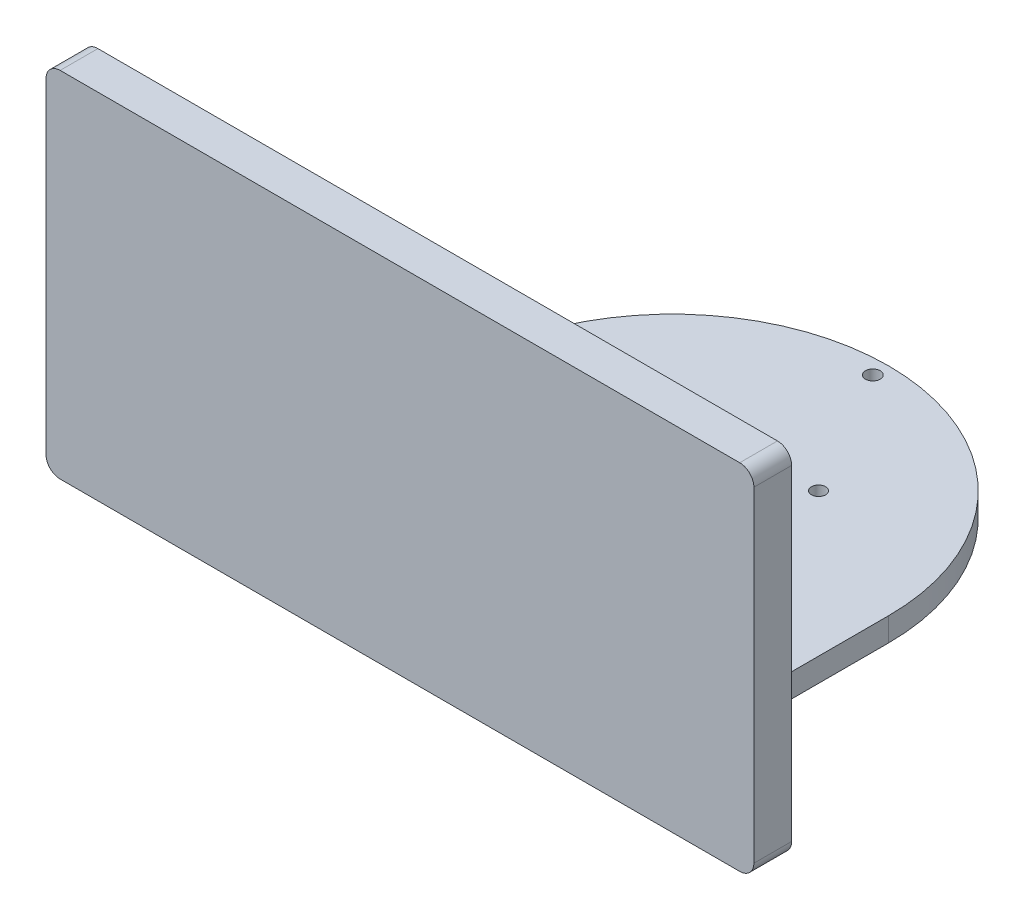
ISO-10303-21;
HEADER;
FILE_DESCRIPTION(('STEP AP214'),'2;1');
FILE_NAME('part.step','',(''),(''),'','','');
FILE_SCHEMA(('AUTOMOTIVE_DESIGN { 1 0 10303 214 1 1 1 1 }'));
ENDSEC;
DATA;
#1=APPLICATION_CONTEXT('core data for automotive mechanical design processes');
#2=APPLICATION_PROTOCOL_DEFINITION('international standard','automotive_design',2000,#1);
#3=PRODUCT_CONTEXT('',#1,'mechanical');
#4=PRODUCT('Part','Part','',(#3));
#5=PRODUCT_RELATED_PRODUCT_CATEGORY('part','',(#4));
#6=PRODUCT_DEFINITION_FORMATION('','',#4);
#7=PRODUCT_DEFINITION_CONTEXT('part definition',#1,'design');
#8=PRODUCT_DEFINITION('design','',#6,#7);
#9=PRODUCT_DEFINITION_SHAPE('','',#8);
#10=(LENGTH_UNIT() NAMED_UNIT(*) SI_UNIT(.MILLI.,.METRE.));
#11=(NAMED_UNIT(*) PLANE_ANGLE_UNIT() SI_UNIT($,.RADIAN.));
#12=(NAMED_UNIT(*) SI_UNIT($,.STERADIAN.) SOLID_ANGLE_UNIT());
#13=UNCERTAINTY_MEASURE_WITH_UNIT(LENGTH_MEASURE(1.E-05),#10,'distance_accuracy_value','');
#14=(GEOMETRIC_REPRESENTATION_CONTEXT(3) GLOBAL_UNCERTAINTY_ASSIGNED_CONTEXT((#13)) GLOBAL_UNIT_ASSIGNED_CONTEXT((#10,
#11,#12)) REPRESENTATION_CONTEXT('',''));
#15=CARTESIAN_POINT('',(0.,0.,0.));
#16=DIRECTION('',(0.,0.,1.));
#17=DIRECTION('',(1.,0.,0.));
#18=AXIS2_PLACEMENT_3D('',#15,#16,#17);
#19=CARTESIAN_POINT('',(0.,5.,0.));
#20=DIRECTION('',(0.,1.,0.));
#21=DIRECTION('',(0.,0.,1.));
#22=AXIS2_PLACEMENT_3D('',#19,#20,#21);
#23=PLANE('',#22);
#24=CARTESIAN_POINT('',(-15.4999999999997,5.,15.5));
#25=DIRECTION('',(0.,1.,0.));
#26=DIRECTION('',(0.,0.,1.));
#27=AXIS2_PLACEMENT_3D('',#24,#25,#26);
#28=CIRCLE('',#27,1.5);
#29=CARTESIAN_POINT('',(-15.4999999999997,5.,17.));
#30=VERTEX_POINT('',#29);
#31=EDGE_CURVE('E183',#30,#30,#28,.T.);
#32=ORIENTED_EDGE('',*,*,#31,.F.);
#33=EDGE_LOOP('',(#32));
#34=FACE_BOUND('',#33,.T.);
#35=CARTESIAN_POINT('',(15.5000000000003,5.,15.5));
#36=DIRECTION('',(0.,1.,0.));
#37=DIRECTION('',(0.,0.,1.));
#38=AXIS2_PLACEMENT_3D('',#35,#36,#37);
#39=CIRCLE('',#38,1.5);
#40=CARTESIAN_POINT('',(15.5000000000003,5.,17.));
#41=VERTEX_POINT('',#40);
#42=EDGE_CURVE('E208',#41,#41,#39,.T.);
#43=ORIENTED_EDGE('',*,*,#42,.F.);
#44=EDGE_LOOP('',(#43));
#45=FACE_BOUND('',#44,.T.);
#46=CARTESIAN_POINT('',(15.5,5.,-15.5));
#47=DIRECTION('',(0.,1.,0.));
#48=DIRECTION('',(0.,0.,1.));
#49=AXIS2_PLACEMENT_3D('',#46,#47,#48);
#50=CIRCLE('',#49,1.5);
#51=CARTESIAN_POINT('',(15.5,5.,-14.));
#52=VERTEX_POINT('',#51);
#53=EDGE_CURVE('E204',#52,#52,#50,.T.);
#54=ORIENTED_EDGE('',*,*,#53,.F.);
#55=EDGE_LOOP('',(#54));
#56=FACE_BOUND('',#55,.T.);
#57=CARTESIAN_POINT('',(0.,5.,0.));
#58=DIRECTION('',(0.,1.,0.));
#59=DIRECTION('',(0.,0.,1.));
#60=AXIS2_PLACEMENT_3D('',#57,#58,#59);
#61=CIRCLE('',#60,7.);
#62=CARTESIAN_POINT('',(0.,5.,7.00000000000001));
#63=VERTEX_POINT('',#62);
#64=EDGE_CURVE('E199',#63,#63,#61,.T.);
#65=ORIENTED_EDGE('',*,*,#64,.F.);
#66=EDGE_LOOP('',(#65));
#67=FACE_BOUND('',#66,.T.);
#68=CARTESIAN_POINT('',(-15.5,5.,-15.5));
#69=DIRECTION('',(0.,1.,0.));
#70=DIRECTION('',(0.,0.,1.));
#71=AXIS2_PLACEMENT_3D('',#68,#69,#70);
#72=CIRCLE('',#71,1.5);
#73=CARTESIAN_POINT('',(-15.5,5.,-14.));
#74=VERTEX_POINT('',#73);
#75=EDGE_CURVE('E203',#74,#74,#72,.T.);
#76=ORIENTED_EDGE('',*,*,#75,.F.);
#77=EDGE_LOOP('',(#76));
#78=FACE_BOUND('',#77,.T.);
#79=CARTESIAN_POINT('',(0.,5.,-42.5));
#80=DIRECTION('',(0.,1.,0.));
#81=DIRECTION('',(0.,0.,1.));
#82=AXIS2_PLACEMENT_3D('',#79,#80,#81);
#83=CIRCLE('',#82,1.565);
#84=CARTESIAN_POINT('',(0.,5.,-40.935));
#85=VERTEX_POINT('',#84);
#86=EDGE_CURVE('E219',#85,#85,#83,.T.);
#87=ORIENTED_EDGE('',*,*,#86,.F.);
#88=EDGE_LOOP('',(#87));
#89=FACE_BOUND('',#88,.T.);
#90=CARTESIAN_POINT('',(36.8060796608414,5.,21.2499999999984));
#91=DIRECTION('',(0.,1.,0.));
#92=DIRECTION('',(0.,0.,1.));
#93=AXIS2_PLACEMENT_3D('',#90,#91,#92);
#94=CIRCLE('',#93,1.56500000000232);
#95=CARTESIAN_POINT('',(36.8060796608414,5.,22.8150000000008));
#96=VERTEX_POINT('',#95);
#97=EDGE_CURVE('E224',#96,#96,#94,.T.);
#98=ORIENTED_EDGE('',*,*,#97,.F.);
#99=EDGE_LOOP('',(#98));
#100=FACE_BOUND('',#99,.T.);
#101=CARTESIAN_POINT('',(-36.8060796608359,5.,21.2500000000016));
#102=DIRECTION('',(0.,1.,0.));
#103=DIRECTION('',(0.,0.,1.));
#104=AXIS2_PLACEMENT_3D('',#101,#102,#103);
#105=CIRCLE('',#104,1.56500000000342);
#106=CARTESIAN_POINT('',(-36.8060796608359,5.,22.815000000005));
#107=VERTEX_POINT('',#106);
#108=EDGE_CURVE('E228',#107,#107,#105,.T.);
#109=ORIENTED_EDGE('',*,*,#108,.F.);
#110=EDGE_LOOP('',(#109));
#111=FACE_BOUND('',#110,.T.);
#112=DIRECTION('',(0.,0.,1.));
#113=VECTOR('',#112,1.);
#114=CARTESIAN_POINT('',(-45.85,5.,0.));
#115=LINE('',#114,#113);
#116=CARTESIAN_POINT('',(-45.85,5.,0.));
#117=VERTEX_POINT('',#116);
#118=CARTESIAN_POINT('',(-45.85,5.,46.7087672773216));
#119=VERTEX_POINT('',#118);
#120=EDGE_CURVE('E190',#117,#119,#115,.T.);
#121=ORIENTED_EDGE('',*,*,#120,.T.);
#122=DIRECTION('',(1.,0.,0.));
#123=VECTOR('',#122,1.);
#124=CARTESIAN_POINT('',(0.,5.,46.7087672773216));
#125=LINE('',#124,#123);
#126=CARTESIAN_POINT('',(45.85,5.,46.7087672773216));
#127=VERTEX_POINT('',#126);
#128=EDGE_CURVE('E276',#119,#127,#125,.T.);
#129=ORIENTED_EDGE('',*,*,#128,.T.);
#130=DIRECTION('',(0.,0.,-1.));
#131=VECTOR('',#130,1.);
#132=CARTESIAN_POINT('',(45.85,5.,57.7087672773216));
#133=LINE('',#132,#131);
#134=CARTESIAN_POINT('',(45.85,5.,0.));
#135=VERTEX_POINT('',#134);
#136=EDGE_CURVE('E193',#127,#135,#133,.T.);
#137=ORIENTED_EDGE('',*,*,#136,.T.);
#138=CARTESIAN_POINT('',(0.,5.,0.));
#139=DIRECTION('',(0.,1.,0.));
#140=DIRECTION('',(0.,0.,1.));
#141=AXIS2_PLACEMENT_3D('',#138,#139,#140);
#142=CIRCLE('',#141,45.85);
#143=EDGE_CURVE('E160',#135,#117,#142,.T.);
#144=ORIENTED_EDGE('',*,*,#143,.T.);
#145=EDGE_LOOP('',(#121,#129,#137,#144));
#146=FACE_BOUND('',#145,.T.);
#147=ADVANCED_FACE('F43',(#34,#45,#56,#67,#78,#89,#100,#111,#146),#23,.T.);
#148=CARTESIAN_POINT('',(45.85,-108.347551059856,57.7087672773216));
#149=DIRECTION('',(1.,0.,0.));
#150=DIRECTION('',(0.,0.,-1.));
#151=AXIS2_PLACEMENT_3D('',#148,#149,#150);
#152=PLANE('',#151);
#153=ORIENTED_EDGE('',*,*,#136,.F.);
#154=DIRECTION('',(0.,-1.,0.));
#155=VECTOR('',#154,1.);
#156=CARTESIAN_POINT('',(45.85,-108.347551059856,46.7087672773216));
#157=LINE('',#156,#155);
#158=CARTESIAN_POINT('',(45.85,0.,46.7087672773216));
#159=VERTEX_POINT('',#158);
#160=EDGE_CURVE('E177',#127,#159,#157,.T.);
#161=ORIENTED_EDGE('',*,*,#160,.T.);
#162=DIRECTION('',(0.,0.,1.));
#163=VECTOR('',#162,1.);
#164=CARTESIAN_POINT('',(45.85,0.,57.7087672773216));
#165=LINE('',#164,#163);
#166=CARTESIAN_POINT('',(45.85,0.,0.));
#167=VERTEX_POINT('',#166);
#168=EDGE_CURVE('E154',#167,#159,#165,.T.);
#169=ORIENTED_EDGE('',*,*,#168,.F.);
#170=DIRECTION('',(0.,1.,0.));
#171=VECTOR('',#170,1.);
#172=CARTESIAN_POINT('',(45.85,-108.347551059856,0.));
#173=LINE('',#172,#171);
#174=EDGE_CURVE('E165',#167,#135,#173,.T.);
#175=ORIENTED_EDGE('',*,*,#174,.T.);
#176=EDGE_LOOP('',(#153,#161,#169,#175));
#177=FACE_BOUND('',#176,.T.);
#178=ADVANCED_FACE('F175',(#177),#152,.T.);
#179=CARTESIAN_POINT('',(-45.85,-108.347551059856,0.));
#180=DIRECTION('',(-1.,0.,0.));
#181=DIRECTION('',(0.,0.,1.));
#182=AXIS2_PLACEMENT_3D('',#179,#180,#181);
#183=PLANE('',#182);
#184=DIRECTION('',(0.,0.,-1.));
#185=VECTOR('',#184,1.);
#186=CARTESIAN_POINT('',(-45.85,0.,0.));
#187=LINE('',#186,#185);
#188=CARTESIAN_POINT('',(-45.85,0.,46.7087672773216));
#189=VERTEX_POINT('',#188);
#190=CARTESIAN_POINT('',(-45.85,0.,0.));
#191=VERTEX_POINT('',#190);
#192=EDGE_CURVE('E156',#189,#191,#187,.T.);
#193=ORIENTED_EDGE('',*,*,#192,.F.);
#194=DIRECTION('',(0.,1.,0.));
#195=VECTOR('',#194,1.);
#196=CARTESIAN_POINT('',(-45.85,-108.347551059856,46.7087672773216));
#197=LINE('',#196,#195);
#198=EDGE_CURVE('E273',#189,#119,#197,.T.);
#199=ORIENTED_EDGE('',*,*,#198,.T.);
#200=ORIENTED_EDGE('',*,*,#120,.F.);
#201=DIRECTION('',(0.,1.,0.));
#202=VECTOR('',#201,1.);
#203=CARTESIAN_POINT('',(-45.85,-108.347551059856,0.));
#204=LINE('',#203,#202);
#205=EDGE_CURVE('E172',#191,#117,#204,.T.);
#206=ORIENTED_EDGE('',*,*,#205,.F.);
#207=EDGE_LOOP('',(#193,#199,#200,#206));
#208=FACE_BOUND('',#207,.T.);
#209=ADVANCED_FACE('F403',(#208),#183,.T.);
#210=CARTESIAN_POINT('',(0.,5.,0.));
#211=DIRECTION('',(0.,-1.,0.));
#212=DIRECTION('',(0.,0.,-1.));
#213=AXIS2_PLACEMENT_3D('',#210,#211,#212);
#214=CYLINDRICAL_SURFACE('',#213,45.85);
#215=ORIENTED_EDGE('',*,*,#143,.F.);
#216=ORIENTED_EDGE('',*,*,#174,.F.);
#217=CARTESIAN_POINT('',(0.,0.,0.));
#218=DIRECTION('',(0.,1.,0.));
#219=DIRECTION('',(0.,0.,1.));
#220=AXIS2_PLACEMENT_3D('',#217,#218,#219);
#221=CIRCLE('',#220,45.85);
#222=EDGE_CURVE('E147',#167,#191,#221,.T.);
#223=ORIENTED_EDGE('',*,*,#222,.T.);
#224=ORIENTED_EDGE('',*,*,#205,.T.);
#225=EDGE_LOOP('',(#215,#216,#223,#224));
#226=FACE_BOUND('',#225,.T.);
#227=ADVANCED_FACE('F166',(#226),#214,.T.);
#228=CARTESIAN_POINT('',(0.,0.,0.));
#229=DIRECTION('',(0.,1.,0.));
#230=DIRECTION('',(0.,0.,1.));
#231=AXIS2_PLACEMENT_3D('',#228,#229,#230);
#232=PLANE('',#231);
#233=DIRECTION('',(-1.,0.,0.));
#234=VECTOR('',#233,1.);
#235=CARTESIAN_POINT('',(-75.,0.,49.7087672773216));
#236=LINE('',#235,#234);
#237=CARTESIAN_POINT('',(72.,0.,49.7087672773215));
#238=VERTEX_POINT('',#237);
#239=CARTESIAN_POINT('',(48.85,0.,49.7087672773216));
#240=VERTEX_POINT('',#239);
#241=EDGE_CURVE('E364',#238,#240,#236,.T.);
#242=ORIENTED_EDGE('',*,*,#241,.F.);
#243=DIRECTION('',(0.,0.,-1.));
#244=VECTOR('',#243,1.);
#245=CARTESIAN_POINT('',(71.9999999999999,0.,-1.2490009027033E-13));
#246=LINE('',#245,#244);
#247=CARTESIAN_POINT('',(72.,0.,57.7087672773216));
#248=VERTEX_POINT('',#247);
#249=EDGE_CURVE('E316',#238,#248,#246,.F.);
#250=ORIENTED_EDGE('',*,*,#249,.T.);
#251=DIRECTION('',(-1.,0.,0.));
#252=VECTOR('',#251,1.);
#253=CARTESIAN_POINT('',(-45.85,0.,57.7087672773216));
#254=LINE('',#253,#252);
#255=CARTESIAN_POINT('',(-72.,0.,57.7087672773216));
#256=VERTEX_POINT('',#255);
#257=EDGE_CURVE('E171',#248,#256,#254,.T.);
#258=ORIENTED_EDGE('',*,*,#257,.T.);
#259=DIRECTION('',(0.,0.,1.));
#260=VECTOR('',#259,1.);
#261=CARTESIAN_POINT('',(-71.9999999999999,0.,-1.2490009027033E-13));
#262=LINE('',#261,#260);
#263=CARTESIAN_POINT('',(-72.,0.,49.7087672773216));
#264=VERTEX_POINT('',#263);
#265=EDGE_CURVE('E313',#256,#264,#262,.F.);
#266=ORIENTED_EDGE('',*,*,#265,.T.);
#267=CARTESIAN_POINT('',(-48.85,0.,49.7087672773216));
#268=VERTEX_POINT('',#267);
#269=EDGE_CURVE('E294',#268,#264,#236,.T.);
#270=ORIENTED_EDGE('',*,*,#269,.F.);
#271=CARTESIAN_POINT('',(-48.85,0.,46.7087672773216));
#272=DIRECTION('',(0.,1.,0.));
#273=DIRECTION('',(0.,0.,1.));
#274=AXIS2_PLACEMENT_3D('',#271,#272,#273);
#275=CIRCLE('',#274,3.);
#276=EDGE_CURVE('E282',#268,#189,#275,.T.);
#277=ORIENTED_EDGE('',*,*,#276,.T.);
#278=ORIENTED_EDGE('',*,*,#192,.T.);
#279=ORIENTED_EDGE('',*,*,#222,.F.);
#280=ORIENTED_EDGE('',*,*,#168,.T.);
#281=CARTESIAN_POINT('',(48.85,0.,46.7087672773216));
#282=DIRECTION('',(0.,1.,0.));
#283=DIRECTION('',(0.,0.,1.));
#284=AXIS2_PLACEMENT_3D('',#281,#282,#283);
#285=CIRCLE('',#284,3.);
#286=EDGE_CURVE('E279',#159,#240,#285,.T.);
#287=ORIENTED_EDGE('',*,*,#286,.T.);
#288=EDGE_LOOP('',(#242,#250,#258,#266,#270,#277,#278,#279,#280,#287));
#289=FACE_BOUND('',#288,.T.);
#290=CARTESIAN_POINT('',(-36.8060796608359,0.,21.2500000000016));
#291=DIRECTION('',(0.,1.,0.));
#292=DIRECTION('',(0.,0.,1.));
#293=AXIS2_PLACEMENT_3D('',#290,#291,#292);
#294=CIRCLE('',#293,1.56500000000342);
#295=CARTESIAN_POINT('',(-36.8060796608359,0.,22.815000000005));
#296=VERTEX_POINT('',#295);
#297=EDGE_CURVE('E223',#296,#296,#294,.T.);
#298=ORIENTED_EDGE('',*,*,#297,.T.);
#299=EDGE_LOOP('',(#298));
#300=FACE_BOUND('',#299,.T.);
#301=CARTESIAN_POINT('',(36.8060796608414,0.,21.2499999999984));
#302=DIRECTION('',(0.,1.,0.));
#303=DIRECTION('',(0.,0.,1.));
#304=AXIS2_PLACEMENT_3D('',#301,#302,#303);
#305=CIRCLE('',#304,1.56500000000232);
#306=CARTESIAN_POINT('',(36.8060796608414,0.,22.8150000000008));
#307=VERTEX_POINT('',#306);
#308=EDGE_CURVE('E238',#307,#307,#305,.T.);
#309=ORIENTED_EDGE('',*,*,#308,.T.);
#310=EDGE_LOOP('',(#309));
#311=FACE_BOUND('',#310,.T.);
#312=CARTESIAN_POINT('',(0.,0.,-42.5));
#313=DIRECTION('',(0.,1.,0.));
#314=DIRECTION('',(0.,0.,1.));
#315=AXIS2_PLACEMENT_3D('',#312,#313,#314);
#316=CIRCLE('',#315,1.565);
#317=CARTESIAN_POINT('',(0.,0.,-40.935));
#318=VERTEX_POINT('',#317);
#319=EDGE_CURVE('E161',#318,#318,#316,.T.);
#320=ORIENTED_EDGE('',*,*,#319,.T.);
#321=EDGE_LOOP('',(#320));
#322=FACE_BOUND('',#321,.T.);
#323=CARTESIAN_POINT('',(-15.5,0.,-15.5));
#324=DIRECTION('',(0.,1.,0.));
#325=DIRECTION('',(0.,0.,1.));
#326=AXIS2_PLACEMENT_3D('',#323,#324,#325);
#327=CIRCLE('',#326,1.5);
#328=CARTESIAN_POINT('',(-15.5,0.,-14.));
#329=VERTEX_POINT('',#328);
#330=EDGE_CURVE('E218',#329,#329,#327,.T.);
#331=ORIENTED_EDGE('',*,*,#330,.T.);
#332=EDGE_LOOP('',(#331));
#333=FACE_BOUND('',#332,.T.);
#334=CARTESIAN_POINT('',(0.,0.,0.));
#335=DIRECTION('',(0.,1.,0.));
#336=DIRECTION('',(0.,0.,1.));
#337=AXIS2_PLACEMENT_3D('',#334,#335,#336);
#338=CIRCLE('',#337,7.);
#339=CARTESIAN_POINT('',(0.,0.,7.00000000000001));
#340=VERTEX_POINT('',#339);
#341=EDGE_CURVE('E248',#340,#340,#338,.T.);
#342=ORIENTED_EDGE('',*,*,#341,.T.);
#343=EDGE_LOOP('',(#342));
#344=FACE_BOUND('',#343,.T.);
#345=CARTESIAN_POINT('',(15.5,0.,-15.5));
#346=DIRECTION('',(0.,1.,0.));
#347=DIRECTION('',(0.,0.,1.));
#348=AXIS2_PLACEMENT_3D('',#345,#346,#347);
#349=CIRCLE('',#348,1.5);
#350=CARTESIAN_POINT('',(15.5,0.,-14.));
#351=VERTEX_POINT('',#350);
#352=EDGE_CURVE('E252',#351,#351,#349,.T.);
#353=ORIENTED_EDGE('',*,*,#352,.T.);
#354=EDGE_LOOP('',(#353));
#355=FACE_BOUND('',#354,.T.);
#356=CARTESIAN_POINT('',(15.5000000000003,0.,15.5));
#357=DIRECTION('',(0.,1.,0.));
#358=DIRECTION('',(0.,0.,1.));
#359=AXIS2_PLACEMENT_3D('',#356,#357,#358);
#360=CIRCLE('',#359,1.5);
#361=CARTESIAN_POINT('',(15.5000000000003,0.,17.));
#362=VERTEX_POINT('',#361);
#363=EDGE_CURVE('E255',#362,#362,#360,.T.);
#364=ORIENTED_EDGE('',*,*,#363,.T.);
#365=EDGE_LOOP('',(#364));
#366=FACE_BOUND('',#365,.T.);
#367=CARTESIAN_POINT('',(-15.4999999999997,0.,15.5));
#368=DIRECTION('',(0.,1.,0.));
#369=DIRECTION('',(0.,0.,1.));
#370=AXIS2_PLACEMENT_3D('',#367,#368,#369);
#371=CIRCLE('',#370,1.5);
#372=CARTESIAN_POINT('',(-15.4999999999997,0.,17.));
#373=VERTEX_POINT('',#372);
#374=EDGE_CURVE('E232',#373,#373,#371,.T.);
#375=ORIENTED_EDGE('',*,*,#374,.T.);
#376=EDGE_LOOP('',(#375));
#377=FACE_BOUND('',#376,.T.);
#378=ADVANCED_FACE('F150',(#289,#300,#311,#322,#333,#344,#355,#366,#377),#232,.F.);
#379=CARTESIAN_POINT('',(-36.8060796608359,-5.,21.2500000000016));
#380=DIRECTION('',(0.,1.,0.));
#381=DIRECTION('',(0.,0.,1.));
#382=AXIS2_PLACEMENT_3D('',#379,#380,#381);
#383=CYLINDRICAL_SURFACE('',#382,1.56500000000342);
#384=ORIENTED_EDGE('',*,*,#108,.T.);
#385=EDGE_LOOP('',(#384));
#386=FACE_BOUND('',#385,.T.);
#387=ORIENTED_EDGE('',*,*,#297,.F.);
#388=EDGE_LOOP('',(#387));
#389=FACE_BOUND('',#388,.T.);
#390=ADVANCED_FACE('F431',(#386,#389),#383,.F.);
#391=CARTESIAN_POINT('',(36.8060796608414,-5.,21.2499999999984));
#392=DIRECTION('',(0.,1.,0.));
#393=DIRECTION('',(0.,0.,1.));
#394=AXIS2_PLACEMENT_3D('',#391,#392,#393);
#395=CYLINDRICAL_SURFACE('',#394,1.56500000000232);
#396=ORIENTED_EDGE('',*,*,#97,.T.);
#397=EDGE_LOOP('',(#396));
#398=FACE_BOUND('',#397,.T.);
#399=ORIENTED_EDGE('',*,*,#308,.F.);
#400=EDGE_LOOP('',(#399));
#401=FACE_BOUND('',#400,.T.);
#402=ADVANCED_FACE('F465',(#398,#401),#395,.F.);
#403=CARTESIAN_POINT('',(0.,-5.,-42.5));
#404=DIRECTION('',(0.,1.,0.));
#405=DIRECTION('',(0.,0.,1.));
#406=AXIS2_PLACEMENT_3D('',#403,#404,#405);
#407=CYLINDRICAL_SURFACE('',#406,1.565);
#408=ORIENTED_EDGE('',*,*,#86,.T.);
#409=EDGE_LOOP('',(#408));
#410=FACE_BOUND('',#409,.T.);
#411=ORIENTED_EDGE('',*,*,#319,.F.);
#412=EDGE_LOOP('',(#411));
#413=FACE_BOUND('',#412,.T.);
#414=ADVANCED_FACE('F462',(#410,#413),#407,.F.);
#415=CARTESIAN_POINT('',(-15.5,-5.,-15.5));
#416=DIRECTION('',(0.,1.,0.));
#417=DIRECTION('',(0.,0.,1.));
#418=AXIS2_PLACEMENT_3D('',#415,#416,#417);
#419=CYLINDRICAL_SURFACE('',#418,1.5);
#420=ORIENTED_EDGE('',*,*,#75,.T.);
#421=EDGE_LOOP('',(#420));
#422=FACE_BOUND('',#421,.T.);
#423=ORIENTED_EDGE('',*,*,#330,.F.);
#424=EDGE_LOOP('',(#423));
#425=FACE_BOUND('',#424,.T.);
#426=ADVANCED_FACE('F447',(#422,#425),#419,.F.);
#427=CARTESIAN_POINT('',(0.,-5.,0.));
#428=DIRECTION('',(0.,1.,0.));
#429=DIRECTION('',(0.,0.,1.));
#430=AXIS2_PLACEMENT_3D('',#427,#428,#429);
#431=CYLINDRICAL_SURFACE('',#430,7.);
#432=ORIENTED_EDGE('',*,*,#64,.T.);
#433=EDGE_LOOP('',(#432));
#434=FACE_BOUND('',#433,.T.);
#435=ORIENTED_EDGE('',*,*,#341,.F.);
#436=EDGE_LOOP('',(#435));
#437=FACE_BOUND('',#436,.T.);
#438=ADVANCED_FACE('F443',(#434,#437),#431,.F.);
#439=CARTESIAN_POINT('',(15.5,-5.,-15.5));
#440=DIRECTION('',(0.,1.,0.));
#441=DIRECTION('',(0.,0.,1.));
#442=AXIS2_PLACEMENT_3D('',#439,#440,#441);
#443=CYLINDRICAL_SURFACE('',#442,1.5);
#444=ORIENTED_EDGE('',*,*,#53,.T.);
#445=EDGE_LOOP('',(#444));
#446=FACE_BOUND('',#445,.T.);
#447=ORIENTED_EDGE('',*,*,#352,.F.);
#448=EDGE_LOOP('',(#447));
#449=FACE_BOUND('',#448,.T.);
#450=ADVANCED_FACE('F446',(#446,#449),#443,.F.);
#451=CARTESIAN_POINT('',(15.5000000000003,-5.,15.5));
#452=DIRECTION('',(0.,1.,0.));
#453=DIRECTION('',(0.,0.,1.));
#454=AXIS2_PLACEMENT_3D('',#451,#452,#453);
#455=CYLINDRICAL_SURFACE('',#454,1.5);
#456=ORIENTED_EDGE('',*,*,#42,.T.);
#457=EDGE_LOOP('',(#456));
#458=FACE_BOUND('',#457,.T.);
#459=ORIENTED_EDGE('',*,*,#363,.F.);
#460=EDGE_LOOP('',(#459));
#461=FACE_BOUND('',#460,.T.);
#462=ADVANCED_FACE('F451',(#458,#461),#455,.F.);
#463=CARTESIAN_POINT('',(-15.4999999999997,-5.,15.5));
#464=DIRECTION('',(0.,1.,0.));
#465=DIRECTION('',(0.,0.,1.));
#466=AXIS2_PLACEMENT_3D('',#463,#464,#465);
#467=CYLINDRICAL_SURFACE('',#466,1.5);
#468=ORIENTED_EDGE('',*,*,#31,.T.);
#469=EDGE_LOOP('',(#468));
#470=FACE_BOUND('',#469,.T.);
#471=ORIENTED_EDGE('',*,*,#374,.F.);
#472=EDGE_LOOP('',(#471));
#473=FACE_BOUND('',#472,.T.);
#474=ADVANCED_FACE('F455',(#470,#473),#467,.F.);
#475=CARTESIAN_POINT('',(-45.85,-108.347551059856,57.7087672773216));
#476=DIRECTION('',(0.,0.,1.));
#477=DIRECTION('',(1.,0.,0.));
#478=AXIS2_PLACEMENT_3D('',#475,#476,#477);
#479=PLANE('',#478);
#480=ORIENTED_EDGE('',*,*,#257,.F.);
#481=CARTESIAN_POINT('',(72.,3.,57.7087672773216));
#482=DIRECTION('',(0.,0.,1.));
#483=DIRECTION('',(1.,0.,0.));
#484=AXIS2_PLACEMENT_3D('',#481,#482,#483);
#485=CIRCLE('',#484,3.);
#486=CARTESIAN_POINT('',(75.,3.,57.7087672773215));
#487=VERTEX_POINT('',#486);
#488=EDGE_CURVE('E326',#248,#487,#485,.T.);
#489=ORIENTED_EDGE('',*,*,#488,.T.);
#490=DIRECTION('',(0.,-1.,0.));
#491=VECTOR('',#490,1.);
#492=CARTESIAN_POINT('',(75.,75.,57.7087672773215));
#493=LINE('',#492,#491);
#494=CARTESIAN_POINT('',(75.,72.,57.7087672773215));
#495=VERTEX_POINT('',#494);
#496=EDGE_CURVE('E369',#495,#487,#493,.T.);
#497=ORIENTED_EDGE('',*,*,#496,.F.);
#498=CARTESIAN_POINT('',(72.,72.,57.7087672773216));
#499=DIRECTION('',(0.,0.,1.));
#500=DIRECTION('',(1.,0.,0.));
#501=AXIS2_PLACEMENT_3D('',#498,#499,#500);
#502=CIRCLE('',#501,3.);
#503=CARTESIAN_POINT('',(72.,75.,57.7087672773215));
#504=VERTEX_POINT('',#503);
#505=EDGE_CURVE('E319',#495,#504,#502,.T.);
#506=ORIENTED_EDGE('',*,*,#505,.T.);
#507=DIRECTION('',(1.,0.,0.));
#508=VECTOR('',#507,1.);
#509=CARTESIAN_POINT('',(-75.,75.,57.7087672773216));
#510=LINE('',#509,#508);
#511=CARTESIAN_POINT('',(-72.,75.,57.7087672773216));
#512=VERTEX_POINT('',#511);
#513=EDGE_CURVE('E345',#512,#504,#510,.T.);
#514=ORIENTED_EDGE('',*,*,#513,.F.);
#515=CARTESIAN_POINT('',(-72.,72.,57.7087672773216));
#516=DIRECTION('',(0.,0.,1.));
#517=DIRECTION('',(1.,0.,0.));
#518=AXIS2_PLACEMENT_3D('',#515,#516,#517);
#519=CIRCLE('',#518,3.);
#520=CARTESIAN_POINT('',(-75.,72.,57.7087672773216));
#521=VERTEX_POINT('',#520);
#522=EDGE_CURVE('E67',#512,#521,#519,.T.);
#523=ORIENTED_EDGE('',*,*,#522,.T.);
#524=DIRECTION('',(0.,-1.,0.));
#525=VECTOR('',#524,1.);
#526=CARTESIAN_POINT('',(-75.,75.,57.7087672773216));
#527=LINE('',#526,#525);
#528=CARTESIAN_POINT('',(-75.,3.,57.7087672773216));
#529=VERTEX_POINT('',#528);
#530=EDGE_CURVE('E194',#521,#529,#527,.T.);
#531=ORIENTED_EDGE('',*,*,#530,.T.);
#532=CARTESIAN_POINT('',(-72.,3.,57.7087672773216));
#533=DIRECTION('',(0.,0.,1.));
#534=DIRECTION('',(1.,0.,0.));
#535=AXIS2_PLACEMENT_3D('',#532,#533,#534);
#536=CIRCLE('',#535,3.);
#537=EDGE_CURVE('E59',#529,#256,#536,.T.);
#538=ORIENTED_EDGE('',*,*,#537,.T.);
#539=EDGE_LOOP('',(#480,#489,#497,#506,#514,#523,#531,#538));
#540=FACE_BOUND('',#539,.T.);
#541=ADVANCED_FACE('F373',(#540),#479,.T.);
#542=CARTESIAN_POINT('',(-75.,75.,57.7087672773216));
#543=DIRECTION('',(1.,0.,0.));
#544=DIRECTION('',(0.,0.,-1.));
#545=AXIS2_PLACEMENT_3D('',#542,#543,#544);
#546=PLANE('',#545);
#547=DIRECTION('',(0.,-1.,0.));
#548=VECTOR('',#547,1.);
#549=CARTESIAN_POINT('',(-75.,75.,49.7087672773216));
#550=LINE('',#549,#548);
#551=CARTESIAN_POINT('',(-75.,72.,49.7087672773216));
#552=VERTEX_POINT('',#551);
#553=CARTESIAN_POINT('',(-75.,3.,49.7087672773216));
#554=VERTEX_POINT('',#553);
#555=EDGE_CURVE('E355',#552,#554,#550,.T.);
#556=ORIENTED_EDGE('',*,*,#555,.T.);
#557=DIRECTION('',(0.,0.,1.));
#558=VECTOR('',#557,1.);
#559=CARTESIAN_POINT('',(-75.,3.,57.7087672773216));
#560=LINE('',#559,#558);
#561=EDGE_CURVE('E332',#554,#529,#560,.T.);
#562=ORIENTED_EDGE('',*,*,#561,.T.);
#563=ORIENTED_EDGE('',*,*,#530,.F.);
#564=DIRECTION('',(0.,0.,1.));
#565=VECTOR('',#564,1.);
#566=CARTESIAN_POINT('',(-75.,72.,57.7087672773216));
#567=LINE('',#566,#565);
#568=EDGE_CURVE('E329',#521,#552,#567,.F.);
#569=ORIENTED_EDGE('',*,*,#568,.T.);
#570=EDGE_LOOP('',(#556,#562,#563,#569));
#571=FACE_BOUND('',#570,.T.);
#572=ADVANCED_FACE('F376',(#571),#546,.F.);
#573=CARTESIAN_POINT('',(75.,75.,57.7087672773215));
#574=DIRECTION('',(-1.,0.,0.));
#575=DIRECTION('',(0.,0.,1.));
#576=AXIS2_PLACEMENT_3D('',#573,#574,#575);
#577=PLANE('',#576);
#578=ORIENTED_EDGE('',*,*,#496,.T.);
#579=DIRECTION('',(0.,0.,-1.));
#580=VECTOR('',#579,1.);
#581=CARTESIAN_POINT('',(75.,3.,57.7087672773215));
#582=LINE('',#581,#580);
#583=CARTESIAN_POINT('',(75.,3.,49.7087672773215));
#584=VERTEX_POINT('',#583);
#585=EDGE_CURVE('E297',#487,#584,#582,.T.);
#586=ORIENTED_EDGE('',*,*,#585,.T.);
#587=DIRECTION('',(0.,-1.,0.));
#588=VECTOR('',#587,1.);
#589=CARTESIAN_POINT('',(75.,75.,49.7087672773215));
#590=LINE('',#589,#588);
#591=CARTESIAN_POINT('',(75.,72.,49.7087672773215));
#592=VERTEX_POINT('',#591);
#593=EDGE_CURVE('E361',#592,#584,#590,.T.);
#594=ORIENTED_EDGE('',*,*,#593,.F.);
#595=DIRECTION('',(0.,0.,-1.));
#596=VECTOR('',#595,1.);
#597=CARTESIAN_POINT('',(75.,72.,57.7087672773215));
#598=LINE('',#597,#596);
#599=EDGE_CURVE('E285',#592,#495,#598,.F.);
#600=ORIENTED_EDGE('',*,*,#599,.T.);
#601=EDGE_LOOP('',(#578,#586,#594,#600));
#602=FACE_BOUND('',#601,.T.);
#603=ADVANCED_FACE('F382',(#602),#577,.F.);
#604=CARTESIAN_POINT('',(-75.,75.,49.7087672773216));
#605=DIRECTION('',(0.,0.,1.));
#606=DIRECTION('',(1.,0.,0.));
#607=AXIS2_PLACEMENT_3D('',#604,#605,#606);
#608=PLANE('',#607);
#609=ORIENTED_EDGE('',*,*,#593,.T.);
#610=CARTESIAN_POINT('',(72.,3.,49.7087672773215));
#611=DIRECTION('',(0.,0.,1.));
#612=DIRECTION('',(1.,0.,0.));
#613=AXIS2_PLACEMENT_3D('',#610,#611,#612);
#614=CIRCLE('',#613,3.);
#615=EDGE_CURVE('E310',#584,#238,#614,.F.);
#616=ORIENTED_EDGE('',*,*,#615,.T.);
#617=ORIENTED_EDGE('',*,*,#241,.T.);
#618=DIRECTION('',(0.,-1.,0.));
#619=VECTOR('',#618,1.);
#620=CARTESIAN_POINT('',(48.85,75.,49.7087672773216));
#621=LINE('',#620,#619);
#622=CARTESIAN_POINT('',(48.85,8.,49.7087672773216));
#623=VERTEX_POINT('',#622);
#624=EDGE_CURVE('E270',#240,#623,#621,.F.);
#625=ORIENTED_EDGE('',*,*,#624,.T.);
#626=DIRECTION('',(1.,0.,0.));
#627=VECTOR('',#626,1.);
#628=CARTESIAN_POINT('',(-75.,7.99999999999999,49.7087672773216));
#629=LINE('',#628,#627);
#630=CARTESIAN_POINT('',(-48.85,8.,49.7087672773216));
#631=VERTEX_POINT('',#630);
#632=EDGE_CURVE('E264',#623,#631,#629,.F.);
#633=ORIENTED_EDGE('',*,*,#632,.T.);
#634=DIRECTION('',(0.,1.,0.));
#635=VECTOR('',#634,1.);
#636=CARTESIAN_POINT('',(-48.85,75.,49.7087672773216));
#637=LINE('',#636,#635);
#638=EDGE_CURVE('E267',#631,#268,#637,.F.);
#639=ORIENTED_EDGE('',*,*,#638,.T.);
#640=ORIENTED_EDGE('',*,*,#269,.T.);
#641=CARTESIAN_POINT('',(-72.,3.,49.7087672773216));
#642=DIRECTION('',(0.,0.,1.));
#643=DIRECTION('',(1.,0.,0.));
#644=AXIS2_PLACEMENT_3D('',#641,#642,#643);
#645=CIRCLE('',#644,3.);
#646=EDGE_CURVE('E307',#264,#554,#645,.F.);
#647=ORIENTED_EDGE('',*,*,#646,.T.);
#648=ORIENTED_EDGE('',*,*,#555,.F.);
#649=CARTESIAN_POINT('',(-72.,72.,49.7087672773216));
#650=DIRECTION('',(0.,0.,1.));
#651=DIRECTION('',(1.,0.,0.));
#652=AXIS2_PLACEMENT_3D('',#649,#650,#651);
#653=CIRCLE('',#652,3.);
#654=CARTESIAN_POINT('',(-72.,75.,49.7087672773216));
#655=VERTEX_POINT('',#654);
#656=EDGE_CURVE('E304',#552,#655,#653,.F.);
#657=ORIENTED_EDGE('',*,*,#656,.T.);
#658=DIRECTION('',(-1.,0.,0.));
#659=VECTOR('',#658,1.);
#660=CARTESIAN_POINT('',(-75.,75.,49.7087672773216));
#661=LINE('',#660,#659);
#662=CARTESIAN_POINT('',(72.,75.,49.7087672773215));
#663=VERTEX_POINT('',#662);
#664=EDGE_CURVE('E343',#663,#655,#661,.T.);
#665=ORIENTED_EDGE('',*,*,#664,.F.);
#666=CARTESIAN_POINT('',(72.,72.,49.7087672773215));
#667=DIRECTION('',(0.,0.,1.));
#668=DIRECTION('',(1.,0.,0.));
#669=AXIS2_PLACEMENT_3D('',#666,#667,#668);
#670=CIRCLE('',#669,3.);
#671=EDGE_CURVE('E301',#663,#592,#670,.F.);
#672=ORIENTED_EDGE('',*,*,#671,.T.);
#673=EDGE_LOOP('',(#609,#616,#617,#625,#633,#639,#640,#647,#648,#657,#665,#672));
#674=FACE_BOUND('',#673,.T.);
#675=ADVANCED_FACE('F350',(#674),#608,.F.);
#676=CARTESIAN_POINT('',(0.,75.,0.));
#677=DIRECTION('',(0.,-1.,0.));
#678=DIRECTION('',(0.,0.,-1.));
#679=AXIS2_PLACEMENT_3D('',#676,#677,#678);
#680=PLANE('',#679);
#681=ORIENTED_EDGE('',*,*,#664,.T.);
#682=DIRECTION('',(0.,0.,1.));
#683=VECTOR('',#682,1.);
#684=CARTESIAN_POINT('',(-71.9999999999999,75.,-1.2490009027033E-13));
#685=LINE('',#684,#683);
#686=EDGE_CURVE('E11',#655,#512,#685,.T.);
#687=ORIENTED_EDGE('',*,*,#686,.T.);
#688=ORIENTED_EDGE('',*,*,#513,.T.);
#689=DIRECTION('',(0.,0.,-1.));
#690=VECTOR('',#689,1.);
#691=CARTESIAN_POINT('',(71.9999999999999,75.,-1.2490009027033E-13));
#692=LINE('',#691,#690);
#693=EDGE_CURVE('E52',#504,#663,#692,.T.);
#694=ORIENTED_EDGE('',*,*,#693,.T.);
#695=EDGE_LOOP('',(#681,#687,#688,#694));
#696=FACE_BOUND('',#695,.T.);
#697=ADVANCED_FACE('F342',(#696),#680,.F.);
#698=CARTESIAN_POINT('',(-48.85,-108.347551059856,46.7087672773216));
#699=DIRECTION('',(0.,1.,0.));
#700=DIRECTION('',(0.,0.,1.));
#701=AXIS2_PLACEMENT_3D('',#698,#699,#700);
#702=CYLINDRICAL_SURFACE('',#701,3.);
#703=ORIENTED_EDGE('',*,*,#276,.F.);
#704=ORIENTED_EDGE('',*,*,#638,.F.);
#705=CARTESIAN_POINT('',(-48.85,8.,46.7087672773216));
#706=DIRECTION('',(0.707106781186547,0.707106781186547,0.));
#707=DIRECTION('',(0.707106781186547,-0.707106781186547,0.));
#708=AXIS2_PLACEMENT_3D('',#705,#706,#707);
#709=ELLIPSE('',#708,4.24264068711928,3.);
#710=EDGE_CURVE('E290',#119,#631,#709,.F.);
#711=ORIENTED_EDGE('',*,*,#710,.F.);
#712=ORIENTED_EDGE('',*,*,#198,.F.);
#713=EDGE_LOOP('',(#703,#704,#711,#712));
#714=FACE_BOUND('',#713,.T.);
#715=ADVANCED_FACE('F398',(#714),#702,.F.);
#716=CARTESIAN_POINT('',(0.,8.,46.7087672773216));
#717=DIRECTION('',(1.,0.,0.));
#718=DIRECTION('',(0.,0.,-1.));
#719=AXIS2_PLACEMENT_3D('',#716,#717,#718);
#720=CYLINDRICAL_SURFACE('',#719,3.);
#721=ORIENTED_EDGE('',*,*,#710,.T.);
#722=ORIENTED_EDGE('',*,*,#632,.F.);
#723=CARTESIAN_POINT('',(48.85,8.,46.7087672773216));
#724=DIRECTION('',(0.707106781186547,-0.707106781186547,0.));
#725=DIRECTION('',(0.707106781186547,0.707106781186547,0.));
#726=AXIS2_PLACEMENT_3D('',#723,#724,#725);
#727=ELLIPSE('',#726,4.24264068711928,3.);
#728=EDGE_CURVE('E286',#127,#623,#727,.F.);
#729=ORIENTED_EDGE('',*,*,#728,.F.);
#730=ORIENTED_EDGE('',*,*,#128,.F.);
#731=EDGE_LOOP('',(#721,#722,#729,#730));
#732=FACE_BOUND('',#731,.T.);
#733=ADVANCED_FACE('F408',(#732),#720,.F.);
#734=CARTESIAN_POINT('',(48.85,-108.347551059856,46.7087672773216));
#735=DIRECTION('',(0.,-1.,0.));
#736=DIRECTION('',(0.,0.,-1.));
#737=AXIS2_PLACEMENT_3D('',#734,#735,#736);
#738=CYLINDRICAL_SURFACE('',#737,3.);
#739=ORIENTED_EDGE('',*,*,#728,.T.);
#740=ORIENTED_EDGE('',*,*,#624,.F.);
#741=ORIENTED_EDGE('',*,*,#286,.F.);
#742=ORIENTED_EDGE('',*,*,#160,.F.);
#743=EDGE_LOOP('',(#739,#740,#741,#742));
#744=FACE_BOUND('',#743,.T.);
#745=ADVANCED_FACE('F410',(#744),#738,.F.);
#746=CARTESIAN_POINT('',(72.,3.,57.7087672773216));
#747=DIRECTION('',(0.,0.,-1.));
#748=DIRECTION('',(-1.,0.,0.));
#749=AXIS2_PLACEMENT_3D('',#746,#747,#748);
#750=CYLINDRICAL_SURFACE('',#749,3.);
#751=ORIENTED_EDGE('',*,*,#488,.F.);
#752=ORIENTED_EDGE('',*,*,#249,.F.);
#753=ORIENTED_EDGE('',*,*,#615,.F.);
#754=ORIENTED_EDGE('',*,*,#585,.F.);
#755=EDGE_LOOP('',(#751,#752,#753,#754));
#756=FACE_BOUND('',#755,.T.);
#757=ADVANCED_FACE('F388',(#756),#750,.T.);
#758=CARTESIAN_POINT('',(-72.,3.,57.7087672773216));
#759=DIRECTION('',(0.,0.,1.));
#760=DIRECTION('',(1.,0.,0.));
#761=AXIS2_PLACEMENT_3D('',#758,#759,#760);
#762=CYLINDRICAL_SURFACE('',#761,3.);
#763=ORIENTED_EDGE('',*,*,#646,.F.);
#764=ORIENTED_EDGE('',*,*,#265,.F.);
#765=ORIENTED_EDGE('',*,*,#537,.F.);
#766=ORIENTED_EDGE('',*,*,#561,.F.);
#767=EDGE_LOOP('',(#763,#764,#765,#766));
#768=FACE_BOUND('',#767,.T.);
#769=ADVANCED_FACE('F392',(#768),#762,.T.);
#770=CARTESIAN_POINT('',(-71.9999999999999,72.,-1.2490009027033E-13));
#771=DIRECTION('',(0.,0.,1.));
#772=DIRECTION('',(1.,0.,0.));
#773=AXIS2_PLACEMENT_3D('',#770,#771,#772);
#774=CYLINDRICAL_SURFACE('',#773,3.);
#775=ORIENTED_EDGE('',*,*,#656,.F.);
#776=ORIENTED_EDGE('',*,*,#568,.F.);
#777=ORIENTED_EDGE('',*,*,#522,.F.);
#778=ORIENTED_EDGE('',*,*,#686,.F.);
#779=EDGE_LOOP('',(#775,#776,#777,#778));
#780=FACE_BOUND('',#779,.T.);
#781=ADVANCED_FACE('F378',(#780),#774,.T.);
#782=CARTESIAN_POINT('',(71.9999999999999,72.,-1.2490009027033E-13));
#783=DIRECTION('',(0.,0.,-1.));
#784=DIRECTION('',(-1.,0.,0.));
#785=AXIS2_PLACEMENT_3D('',#782,#783,#784);
#786=CYLINDRICAL_SURFACE('',#785,3.);
#787=ORIENTED_EDGE('',*,*,#505,.F.);
#788=ORIENTED_EDGE('',*,*,#599,.F.);
#789=ORIENTED_EDGE('',*,*,#671,.F.);
#790=ORIENTED_EDGE('',*,*,#693,.F.);
#791=EDGE_LOOP('',(#787,#788,#789,#790));
#792=FACE_BOUND('',#791,.T.);
#793=ADVANCED_FACE('F45',(#792),#786,.T.);
#794=CLOSED_SHELL('',(#147,#178,#209,#227,#378,#390,#402,#414,#426,#438,#450,#462,#474,#541,
#572,#603,#675,#697,#715,#733,#745,#757,#769,#781,#793));
#795=MANIFOLD_SOLID_BREP('B2',#794);
#796=ADVANCED_BREP_SHAPE_REPRESENTATION('',(#18,#795),#14);
#797=SHAPE_DEFINITION_REPRESENTATION(#9,#796);
ENDSEC;
END-ISO-10303-21;
